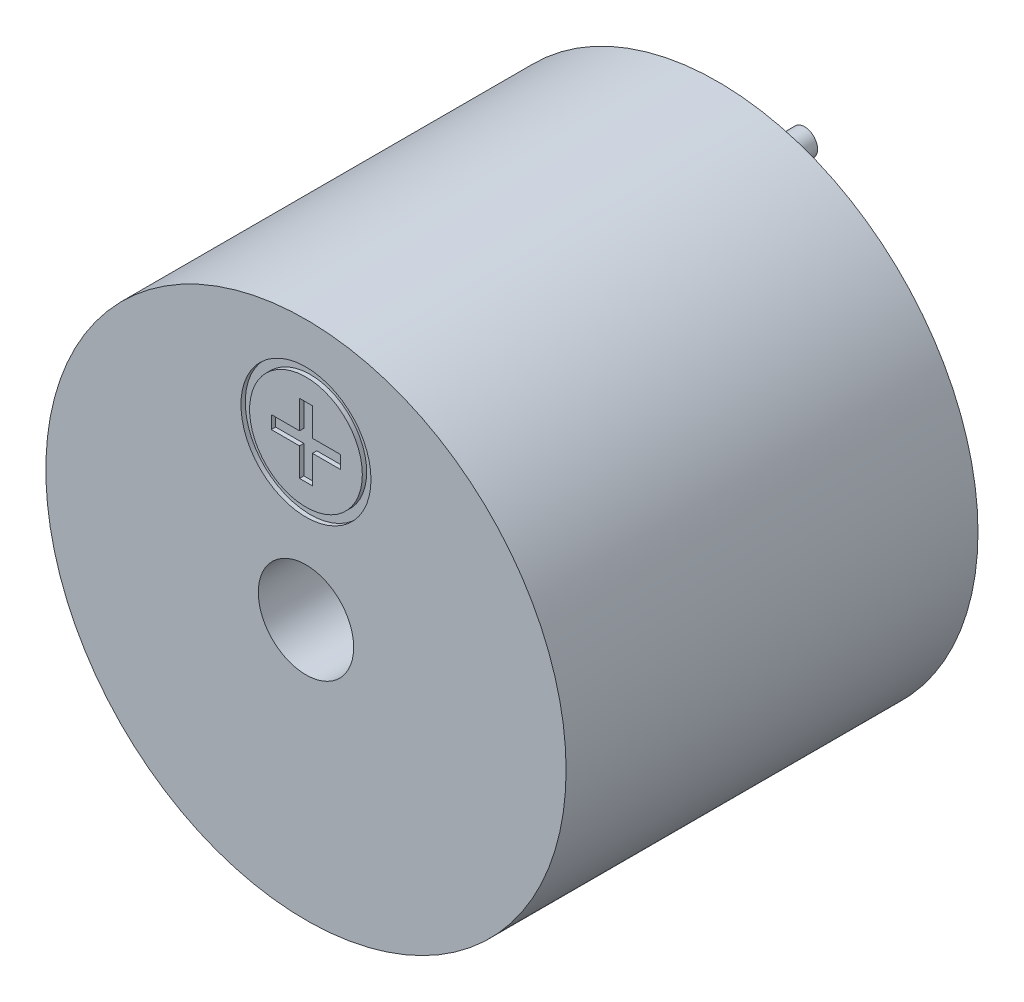
ISO-10303-21;
HEADER;
FILE_DESCRIPTION(('STEP AP214'),'2;1');
FILE_NAME('part.step','',(''),(''),'','','');
FILE_SCHEMA(('AUTOMOTIVE_DESIGN { 1 0 10303 214 1 1 1 1 }'));
ENDSEC;
DATA;
#1=APPLICATION_CONTEXT('core data for automotive mechanical design processes');
#2=APPLICATION_PROTOCOL_DEFINITION('international standard','automotive_design',2000,#1);
#3=PRODUCT_CONTEXT('',#1,'mechanical');
#4=PRODUCT('Part','Part','',(#3));
#5=PRODUCT_RELATED_PRODUCT_CATEGORY('part','',(#4));
#6=PRODUCT_DEFINITION_FORMATION('','',#4);
#7=PRODUCT_DEFINITION_CONTEXT('part definition',#1,'design');
#8=PRODUCT_DEFINITION('design','',#6,#7);
#9=PRODUCT_DEFINITION_SHAPE('','',#8);
#10=(LENGTH_UNIT() NAMED_UNIT(*) SI_UNIT(.MILLI.,.METRE.));
#11=(NAMED_UNIT(*) PLANE_ANGLE_UNIT() SI_UNIT($,.RADIAN.));
#12=(NAMED_UNIT(*) SI_UNIT($,.STERADIAN.) SOLID_ANGLE_UNIT());
#13=UNCERTAINTY_MEASURE_WITH_UNIT(LENGTH_MEASURE(1.E-05),#10,'distance_accuracy_value','');
#14=(GEOMETRIC_REPRESENTATION_CONTEXT(3) GLOBAL_UNCERTAINTY_ASSIGNED_CONTEXT((#13)) GLOBAL_UNIT_ASSIGNED_CONTEXT((#10,
#11,#12)) REPRESENTATION_CONTEXT('',''));
#15=CARTESIAN_POINT('',(0.,0.,0.));
#16=DIRECTION('',(0.,0.,1.));
#17=DIRECTION('',(1.,0.,0.));
#18=AXIS2_PLACEMENT_3D('',#15,#16,#17);
#19=CARTESIAN_POINT('',(0.,0.,3.));
#20=DIRECTION('',(0.,0.,-1.));
#21=DIRECTION('',(-1.,0.,0.));
#22=AXIS2_PLACEMENT_3D('',#19,#20,#21);
#23=CYLINDRICAL_SURFACE('',#22,6.);
#24=CARTESIAN_POINT('',(0.,0.,0.));
#25=DIRECTION('',(0.,0.,1.));
#26=DIRECTION('',(1.,0.,0.));
#27=AXIS2_PLACEMENT_3D('',#24,#25,#26);
#28=CIRCLE('',#27,6.);
#29=CARTESIAN_POINT('',(6.,0.,0.));
#30=VERTEX_POINT('',#29);
#31=EDGE_CURVE('E298',#30,#30,#28,.T.);
#32=ORIENTED_EDGE('',*,*,#31,.T.);
#33=EDGE_LOOP('',(#32));
#34=FACE_BOUND('',#33,.T.);
#35=CARTESIAN_POINT('',(0.,0.,9.5));
#36=DIRECTION('',(0.,0.,1.));
#37=DIRECTION('',(1.,0.,0.));
#38=AXIS2_PLACEMENT_3D('',#35,#36,#37);
#39=CIRCLE('',#38,6.);
#40=CARTESIAN_POINT('',(6.,0.,9.5));
#41=VERTEX_POINT('',#40);
#42=EDGE_CURVE('E291',#41,#41,#39,.T.);
#43=ORIENTED_EDGE('',*,*,#42,.F.);
#44=EDGE_LOOP('',(#43));
#45=FACE_BOUND('',#44,.T.);
#46=ADVANCED_FACE('F84',(#34,#45),#23,.T.);
#47=CARTESIAN_POINT('',(0.,0.,0.));
#48=DIRECTION('',(0.,0.,1.));
#49=DIRECTION('',(1.,0.,0.));
#50=AXIS2_PLACEMENT_3D('',#47,#48,#49);
#51=PLANE('',#50);
#52=CARTESIAN_POINT('',(0.,-3.8,0.));
#53=DIRECTION('',(0.,0.,1.));
#54=DIRECTION('',(1.,0.,0.));
#55=AXIS2_PLACEMENT_3D('',#52,#53,#54);
#56=CIRCLE('',#55,0.3);
#57=CARTESIAN_POINT('',(0.3,-3.8,0.));
#58=VERTEX_POINT('',#57);
#59=EDGE_CURVE('E12',#58,#58,#56,.F.);
#60=ORIENTED_EDGE('',*,*,#59,.F.);
#61=EDGE_LOOP('',(#60));
#62=FACE_BOUND('',#61,.T.);
#63=CARTESIAN_POINT('',(0.,3.8,0.));
#64=DIRECTION('',(0.,0.,1.));
#65=DIRECTION('',(1.,0.,0.));
#66=AXIS2_PLACEMENT_3D('',#63,#64,#65);
#67=CIRCLE('',#66,0.3);
#68=CARTESIAN_POINT('',(0.3,3.8,0.));
#69=VERTEX_POINT('',#68);
#70=EDGE_CURVE('E92',#69,#69,#67,.F.);
#71=ORIENTED_EDGE('',*,*,#70,.F.);
#72=EDGE_LOOP('',(#71));
#73=FACE_BOUND('',#72,.T.);
#74=ORIENTED_EDGE('',*,*,#31,.F.);
#75=EDGE_LOOP('',(#74));
#76=FACE_BOUND('',#75,.T.);
#77=ADVANCED_FACE('F307',(#62,#73,#76),#51,.F.);
#78=CARTESIAN_POINT('',(0.,0.,9.5));
#79=DIRECTION('',(0.,0.,1.));
#80=DIRECTION('',(1.,0.,0.));
#81=AXIS2_PLACEMENT_3D('',#78,#79,#80);
#82=PLANE('',#81);
#83=CARTESIAN_POINT('',(0.,3.55,9.5));
#84=DIRECTION('',(0.,0.,1.));
#85=DIRECTION('',(1.,0.,0.));
#86=AXIS2_PLACEMENT_3D('',#83,#84,#85);
#87=CIRCLE('',#86,1.5);
#88=CARTESIAN_POINT('',(1.5,3.55,9.5));
#89=VERTEX_POINT('',#88);
#90=EDGE_CURVE('E352',#89,#89,#87,.T.);
#91=ORIENTED_EDGE('',*,*,#90,.F.);
#92=EDGE_LOOP('',(#91));
#93=FACE_BOUND('',#92,.T.);
#94=CARTESIAN_POINT('',(0.,0.,9.5));
#95=DIRECTION('',(0.,0.,1.));
#96=DIRECTION('',(1.,0.,0.));
#97=AXIS2_PLACEMENT_3D('',#94,#95,#96);
#98=CIRCLE('',#97,1.1);
#99=CARTESIAN_POINT('',(1.1,0.,9.5));
#100=VERTEX_POINT('',#99);
#101=EDGE_CURVE('E259',#100,#100,#98,.T.);
#102=ORIENTED_EDGE('',*,*,#101,.F.);
#103=EDGE_LOOP('',(#102));
#104=FACE_BOUND('',#103,.T.);
#105=ORIENTED_EDGE('',*,*,#42,.T.);
#106=EDGE_LOOP('',(#105));
#107=FACE_BOUND('',#106,.T.);
#108=ADVANCED_FACE('F310',(#93,#104,#107),#82,.T.);
#109=CARTESIAN_POINT('',(0.,0.,3.));
#110=DIRECTION('',(0.,0.,1.));
#111=DIRECTION('',(1.,0.,0.));
#112=AXIS2_PLACEMENT_3D('',#109,#110,#111);
#113=CYLINDRICAL_SURFACE('',#112,1.1);
#114=CARTESIAN_POINT('',(0.,0.,3.));
#115=DIRECTION('',(0.,0.,1.));
#116=DIRECTION('',(1.,0.,0.));
#117=AXIS2_PLACEMENT_3D('',#114,#115,#116);
#118=CIRCLE('',#117,1.1);
#119=CARTESIAN_POINT('',(1.1,0.,3.));
#120=VERTEX_POINT('',#119);
#121=EDGE_CURVE('E287',#120,#120,#118,.T.);
#122=CARTESIAN_POINT('',(1.1,0.,3.));
#123=CARTESIAN_POINT('',(1.1,0.,3.06770833333333));
#124=CARTESIAN_POINT('',(1.1,0.,3.13541666666667));
#125=CARTESIAN_POINT('',(1.1,0.,3.27083333333333));
#126=CARTESIAN_POINT('',(1.1,0.,3.33854166666667));
#127=CARTESIAN_POINT('',(1.1,0.,3.47395833333333));
#128=CARTESIAN_POINT('',(1.1,0.,3.54166666666667));
#129=CARTESIAN_POINT('',(1.1,0.,3.67708333333333));
#130=CARTESIAN_POINT('',(1.1,0.,3.74479166666667));
#131=CARTESIAN_POINT('',(1.1,0.,3.88020833333333));
#132=CARTESIAN_POINT('',(1.1,0.,3.94791666666667));
#133=CARTESIAN_POINT('',(1.1,0.,4.08333333333333));
#134=CARTESIAN_POINT('',(1.1,0.,4.15104166666667));
#135=CARTESIAN_POINT('',(1.1,0.,4.28645833333333));
#136=CARTESIAN_POINT('',(1.1,0.,4.35416666666667));
#137=CARTESIAN_POINT('',(1.1,0.,4.48958333333333));
#138=CARTESIAN_POINT('',(1.1,0.,4.55729166666667));
#139=CARTESIAN_POINT('',(1.1,0.,4.69270833333333));
#140=CARTESIAN_POINT('',(1.1,0.,4.76041666666667));
#141=CARTESIAN_POINT('',(1.1,0.,4.89583333333333));
#142=CARTESIAN_POINT('',(1.1,0.,4.96354166666667));
#143=CARTESIAN_POINT('',(1.1,0.,5.09895833333333));
#144=CARTESIAN_POINT('',(1.1,0.,5.16666666666667));
#145=CARTESIAN_POINT('',(1.1,0.,5.30208333333333));
#146=CARTESIAN_POINT('',(1.1,0.,5.36979166666667));
#147=CARTESIAN_POINT('',(1.1,0.,5.50520833333333));
#148=CARTESIAN_POINT('',(1.1,0.,5.57291666666667));
#149=CARTESIAN_POINT('',(1.1,0.,5.70833333333333));
#150=CARTESIAN_POINT('',(1.1,0.,5.77604166666667));
#151=CARTESIAN_POINT('',(1.1,0.,5.91145833333333));
#152=CARTESIAN_POINT('',(1.1,0.,5.97916666666667));
#153=CARTESIAN_POINT('',(1.1,0.,6.11458333333333));
#154=CARTESIAN_POINT('',(1.1,0.,6.18229166666667));
#155=CARTESIAN_POINT('',(1.1,0.,6.31770833333333));
#156=CARTESIAN_POINT('',(1.1,0.,6.38541666666667));
#157=CARTESIAN_POINT('',(1.1,0.,6.52083333333333));
#158=CARTESIAN_POINT('',(1.1,0.,6.58854166666667));
#159=CARTESIAN_POINT('',(1.1,0.,6.72395833333333));
#160=CARTESIAN_POINT('',(1.1,0.,6.79166666666667));
#161=CARTESIAN_POINT('',(1.1,0.,6.92708333333333));
#162=CARTESIAN_POINT('',(1.1,0.,6.99479166666667));
#163=CARTESIAN_POINT('',(1.1,0.,7.13020833333333));
#164=CARTESIAN_POINT('',(1.1,0.,7.19791666666667));
#165=CARTESIAN_POINT('',(1.1,0.,7.33333333333333));
#166=CARTESIAN_POINT('',(1.1,0.,7.40104166666667));
#167=CARTESIAN_POINT('',(1.1,0.,7.53645833333333));
#168=CARTESIAN_POINT('',(1.1,0.,7.60416666666667));
#169=CARTESIAN_POINT('',(1.1,0.,7.73958333333333));
#170=CARTESIAN_POINT('',(1.1,0.,7.80729166666667));
#171=CARTESIAN_POINT('',(1.1,0.,7.94270833333333));
#172=CARTESIAN_POINT('',(1.1,0.,8.01041666666667));
#173=CARTESIAN_POINT('',(1.1,0.,8.14583333333333));
#174=CARTESIAN_POINT('',(1.1,0.,8.21354166666667));
#175=CARTESIAN_POINT('',(1.1,0.,8.34895833333333));
#176=CARTESIAN_POINT('',(1.1,0.,8.41666666666667));
#177=CARTESIAN_POINT('',(1.1,0.,8.55208333333333));
#178=CARTESIAN_POINT('',(1.1,0.,8.61979166666667));
#179=CARTESIAN_POINT('',(1.1,0.,8.75520833333333));
#180=CARTESIAN_POINT('',(1.1,0.,8.82291666666667));
#181=CARTESIAN_POINT('',(1.1,0.,8.95833333333333));
#182=CARTESIAN_POINT('',(1.1,0.,9.02604166666667));
#183=CARTESIAN_POINT('',(1.1,0.,9.16145833333333));
#184=CARTESIAN_POINT('',(1.1,0.,9.22916666666667));
#185=CARTESIAN_POINT('',(1.1,0.,9.36458333333333));
#186=CARTESIAN_POINT('',(1.1,0.,9.43229166666667));
#187=CARTESIAN_POINT('',(1.1,0.,9.5));
#188=B_SPLINE_CURVE_WITH_KNOTS('',3,(#122,#123,#124,#125,#126,#127,#128,#129,#130,#131,#132,
#133,#134,#135,#136,#137,#138,#139,#140,#141,#142,#143,#144,#145,#146,#147,#148,#149,#150,#151,
#152,#153,#154,#155,#156,#157,#158,#159,#160,#161,#162,#163,#164,#165,#166,#167,#168,#169,#170,
#171,#172,#173,#174,#175,#176,#177,#178,#179,#180,#181,#182,#183,#184,#185,#186,#187),
.UNSPECIFIED.,.F.,.F.,(4,2,2,2,2,2,2,2,2,2,2,2,2,2,2,2,2,2,2,2,2,2,2,2,2,2,2,2,2,2,2,2,4),(0.,
0.203125,0.40625,0.609375,0.8125,1.015625,1.21875,1.421875,1.625,1.828125,2.03125,2.234375,
2.4375,2.640625,2.84375,3.046875,3.25,3.453125,3.65625,3.859375,4.0625,4.265625,4.46875,
4.671875,4.875,5.078125,5.28125,5.484375,5.6875,5.890625,6.09375,6.296875,6.5),.UNSPECIFIED.);
#189=EDGE_CURVE('BSEAM319',#120,#100,#188,.T.);
#190=ORIENTED_EDGE('',*,*,#121,.F.);
#191=ORIENTED_EDGE('',*,*,#101,.T.);
#192=ORIENTED_EDGE('',*,*,#189,.T.);
#193=ORIENTED_EDGE('',*,*,#189,.F.);
#194=EDGE_LOOP('',(#190,#192,#191,#193));
#195=FACE_BOUND('',#194,.T.);
#196=ADVANCED_FACE('F319',(#195),#113,.F.);
#197=CARTESIAN_POINT('',(0.,0.,3.));
#198=DIRECTION('',(0.,0.,1.));
#199=DIRECTION('',(1.,0.,0.));
#200=AXIS2_PLACEMENT_3D('',#197,#198,#199);
#201=PLANE('',#200);
#202=ORIENTED_EDGE('',*,*,#121,.T.);
#203=EDGE_LOOP('',(#202));
#204=FACE_BOUND('',#203,.T.);
#205=ADVANCED_FACE('F326',(#204),#201,.T.);
#206=CARTESIAN_POINT('',(0.,3.55,9.4));
#207=DIRECTION('',(0.,0.,1.));
#208=DIRECTION('',(1.,0.,0.));
#209=AXIS2_PLACEMENT_3D('',#206,#207,#208);
#210=CYLINDRICAL_SURFACE('',#209,1.3);
#211=CARTESIAN_POINT('',(0.,3.55,9.4));
#212=DIRECTION('',(0.,0.,1.));
#213=DIRECTION('',(1.,0.,0.));
#214=AXIS2_PLACEMENT_3D('',#211,#212,#213);
#215=CIRCLE('',#214,1.3);
#216=CARTESIAN_POINT('',(1.3,3.55,9.4));
#217=VERTEX_POINT('',#216);
#218=EDGE_CURVE('E358',#217,#217,#215,.T.);
#219=ORIENTED_EDGE('',*,*,#218,.T.);
#220=EDGE_LOOP('',(#219));
#221=FACE_BOUND('',#220,.T.);
#222=CARTESIAN_POINT('',(0.,3.55,9.5));
#223=DIRECTION('',(0.,0.,1.));
#224=DIRECTION('',(1.,0.,0.));
#225=AXIS2_PLACEMENT_3D('',#222,#223,#224);
#226=CIRCLE('',#225,1.3);
#227=CARTESIAN_POINT('',(1.3,3.55,9.5));
#228=VERTEX_POINT('',#227);
#229=EDGE_CURVE('E349',#228,#228,#226,.T.);
#230=ORIENTED_EDGE('',*,*,#229,.F.);
#231=EDGE_LOOP('',(#230));
#232=FACE_BOUND('',#231,.T.);
#233=ADVANCED_FACE('F440',(#221,#232),#210,.T.);
#234=CARTESIAN_POINT('',(0.,3.55,9.4));
#235=DIRECTION('',(0.,0.,1.));
#236=DIRECTION('',(1.,0.,0.));
#237=AXIS2_PLACEMENT_3D('',#234,#235,#236);
#238=CYLINDRICAL_SURFACE('',#237,1.5);
#239=CARTESIAN_POINT('',(0.,3.55,9.4));
#240=DIRECTION('',(0.,0.,1.));
#241=DIRECTION('',(1.,0.,0.));
#242=AXIS2_PLACEMENT_3D('',#239,#240,#241);
#243=CIRCLE('',#242,1.5);
#244=CARTESIAN_POINT('',(1.5,3.55,9.4));
#245=VERTEX_POINT('',#244);
#246=EDGE_CURVE('E216',#245,#245,#243,.T.);
#247=ORIENTED_EDGE('',*,*,#246,.F.);
#248=EDGE_LOOP('',(#247));
#249=FACE_BOUND('',#248,.T.);
#250=ORIENTED_EDGE('',*,*,#90,.T.);
#251=EDGE_LOOP('',(#250));
#252=FACE_BOUND('',#251,.T.);
#253=ADVANCED_FACE('F341',(#249,#252),#238,.F.);
#254=CARTESIAN_POINT('',(0.,0.,9.4));
#255=DIRECTION('',(0.,0.,1.));
#256=DIRECTION('',(1.,0.,0.));
#257=AXIS2_PLACEMENT_3D('',#254,#255,#256);
#258=PLANE('',#257);
#259=ORIENTED_EDGE('',*,*,#218,.F.);
#260=EDGE_LOOP('',(#259));
#261=FACE_BOUND('',#260,.T.);
#262=ORIENTED_EDGE('',*,*,#246,.T.);
#263=EDGE_LOOP('',(#262));
#264=FACE_BOUND('',#263,.T.);
#265=ADVANCED_FACE('F333',(#261,#264),#258,.T.);
#266=DIRECTION('',(1.,0.,0.));
#267=VECTOR('',#266,1.);
#268=CARTESIAN_POINT('',(0.,2.75,9.5));
#269=LINE('',#268,#267);
#270=CARTESIAN_POINT('',(-0.15,2.75,9.5));
#271=VERTEX_POINT('',#270);
#272=CARTESIAN_POINT('',(0.15,2.75,9.5));
#273=VERTEX_POINT('',#272);
#274=EDGE_CURVE('E99',#271,#273,#269,.T.);
#275=ORIENTED_EDGE('',*,*,#274,.F.);
#276=DIRECTION('',(0.,-1.,0.));
#277=VECTOR('',#276,1.);
#278=CARTESIAN_POINT('',(-0.149999999999999,0.,9.5));
#279=LINE('',#278,#277);
#280=CARTESIAN_POINT('',(-0.15,3.4,9.5));
#281=VERTEX_POINT('',#280);
#282=EDGE_CURVE('E253',#281,#271,#279,.T.);
#283=ORIENTED_EDGE('',*,*,#282,.F.);
#284=DIRECTION('',(1.,0.,0.));
#285=VECTOR('',#284,1.);
#286=CARTESIAN_POINT('',(0.,3.4,9.5));
#287=LINE('',#286,#285);
#288=CARTESIAN_POINT('',(-0.8,3.4,9.5));
#289=VERTEX_POINT('',#288);
#290=EDGE_CURVE('E250',#289,#281,#287,.T.);
#291=ORIENTED_EDGE('',*,*,#290,.F.);
#292=DIRECTION('',(0.,-1.,0.));
#293=VECTOR('',#292,1.);
#294=CARTESIAN_POINT('',(-0.8,0.,9.5));
#295=LINE('',#294,#293);
#296=CARTESIAN_POINT('',(-0.8,3.7,9.5));
#297=VERTEX_POINT('',#296);
#298=EDGE_CURVE('E183',#297,#289,#295,.T.);
#299=ORIENTED_EDGE('',*,*,#298,.F.);
#300=DIRECTION('',(-1.,0.,0.));
#301=VECTOR('',#300,1.);
#302=CARTESIAN_POINT('',(0.,3.7,9.5));
#303=LINE('',#302,#301);
#304=CARTESIAN_POINT('',(-0.15,3.7,9.5));
#305=VERTEX_POINT('',#304);
#306=EDGE_CURVE('E244',#305,#297,#303,.T.);
#307=ORIENTED_EDGE('',*,*,#306,.F.);
#308=DIRECTION('',(0.,-1.,0.));
#309=VECTOR('',#308,1.);
#310=CARTESIAN_POINT('',(-0.15,0.,9.5));
#311=LINE('',#310,#309);
#312=CARTESIAN_POINT('',(-0.15,4.35,9.5));
#313=VERTEX_POINT('',#312);
#314=EDGE_CURVE('E240',#313,#305,#311,.T.);
#315=ORIENTED_EDGE('',*,*,#314,.F.);
#316=DIRECTION('',(-1.,0.,0.));
#317=VECTOR('',#316,1.);
#318=CARTESIAN_POINT('',(0.,4.35,9.5));
#319=LINE('',#318,#317);
#320=CARTESIAN_POINT('',(0.15,4.35,9.5));
#321=VERTEX_POINT('',#320);
#322=EDGE_CURVE('E236',#321,#313,#319,.T.);
#323=ORIENTED_EDGE('',*,*,#322,.F.);
#324=DIRECTION('',(0.,1.,0.));
#325=VECTOR('',#324,1.);
#326=CARTESIAN_POINT('',(0.15,0.,9.5));
#327=LINE('',#326,#325);
#328=CARTESIAN_POINT('',(0.15,3.7,9.5));
#329=VERTEX_POINT('',#328);
#330=EDGE_CURVE('E232',#329,#321,#327,.T.);
#331=ORIENTED_EDGE('',*,*,#330,.F.);
#332=DIRECTION('',(-1.,0.,0.));
#333=VECTOR('',#332,1.);
#334=CARTESIAN_POINT('',(0.,3.7,9.5));
#335=LINE('',#334,#333);
#336=CARTESIAN_POINT('',(0.8,3.7,9.5));
#337=VERTEX_POINT('',#336);
#338=EDGE_CURVE('E228',#337,#329,#335,.T.);
#339=ORIENTED_EDGE('',*,*,#338,.F.);
#340=DIRECTION('',(0.,-1.,0.));
#341=VECTOR('',#340,1.);
#342=CARTESIAN_POINT('',(0.8,0.,9.5));
#343=LINE('',#342,#341);
#344=CARTESIAN_POINT('',(0.8,3.4,9.5));
#345=VERTEX_POINT('',#344);
#346=EDGE_CURVE('E224',#337,#345,#343,.T.);
#347=ORIENTED_EDGE('',*,*,#346,.T.);
#348=DIRECTION('',(-1.,0.,0.));
#349=VECTOR('',#348,1.);
#350=CARTESIAN_POINT('',(0.,3.4,9.5));
#351=LINE('',#350,#349);
#352=CARTESIAN_POINT('',(0.15,3.4,9.5));
#353=VERTEX_POINT('',#352);
#354=EDGE_CURVE('E220',#345,#353,#351,.T.);
#355=ORIENTED_EDGE('',*,*,#354,.T.);
#356=DIRECTION('',(0.,1.,0.));
#357=VECTOR('',#356,1.);
#358=CARTESIAN_POINT('',(0.15,0.,9.5));
#359=LINE('',#358,#357);
#360=EDGE_CURVE('E215',#273,#353,#359,.T.);
#361=ORIENTED_EDGE('',*,*,#360,.F.);
#362=EDGE_LOOP('',(#275,#283,#291,#299,#307,#315,#323,#331,#339,#347,#355,#361));
#363=FACE_BOUND('',#362,.T.);
#364=ORIENTED_EDGE('',*,*,#229,.T.);
#365=EDGE_LOOP('',(#364));
#366=FACE_BOUND('',#365,.T.);
#367=ADVANCED_FACE('F322',(#363,#366),#82,.T.);
#368=CARTESIAN_POINT('',(0.,2.75,9.4));
#369=DIRECTION('',(0.,-1.,0.));
#370=DIRECTION('',(0.,0.,-1.));
#371=AXIS2_PLACEMENT_3D('',#368,#369,#370);
#372=PLANE('',#371);
#373=ORIENTED_EDGE('',*,*,#274,.T.);
#374=DIRECTION('',(0.,0.,1.));
#375=VECTOR('',#374,1.);
#376=CARTESIAN_POINT('',(0.15,2.75,9.4));
#377=LINE('',#376,#375);
#378=CARTESIAN_POINT('',(0.15,2.75,9.4));
#379=VERTEX_POINT('',#378);
#380=EDGE_CURVE('E147',#379,#273,#377,.T.);
#381=ORIENTED_EDGE('',*,*,#380,.F.);
#382=DIRECTION('',(1.,0.,0.));
#383=VECTOR('',#382,1.);
#384=CARTESIAN_POINT('',(0.,2.75,9.4));
#385=LINE('',#384,#383);
#386=CARTESIAN_POINT('',(-0.15,2.75,9.4));
#387=VERTEX_POINT('',#386);
#388=EDGE_CURVE('E256',#387,#379,#385,.T.);
#389=ORIENTED_EDGE('',*,*,#388,.F.);
#390=DIRECTION('',(0.,0.,1.));
#391=VECTOR('',#390,1.);
#392=CARTESIAN_POINT('',(-0.15,2.75,9.4));
#393=LINE('',#392,#391);
#394=EDGE_CURVE('E107',#387,#271,#393,.T.);
#395=ORIENTED_EDGE('',*,*,#394,.T.);
#396=EDGE_LOOP('',(#373,#381,#389,#395));
#397=FACE_BOUND('',#396,.T.);
#398=ADVANCED_FACE('F332',(#397),#372,.F.);
#399=CARTESIAN_POINT('',(-0.149999999999999,0.,9.4));
#400=DIRECTION('',(-1.,0.,0.));
#401=DIRECTION('',(0.,-1.,0.));
#402=AXIS2_PLACEMENT_3D('',#399,#400,#401);
#403=PLANE('',#402);
#404=ORIENTED_EDGE('',*,*,#282,.T.);
#405=ORIENTED_EDGE('',*,*,#394,.F.);
#406=DIRECTION('',(0.,-1.,0.));
#407=VECTOR('',#406,1.);
#408=CARTESIAN_POINT('',(-0.149999999999999,0.,9.4));
#409=LINE('',#408,#407);
#410=CARTESIAN_POINT('',(-0.15,3.4,9.4));
#411=VERTEX_POINT('',#410);
#412=EDGE_CURVE('E197',#411,#387,#409,.T.);
#413=ORIENTED_EDGE('',*,*,#412,.F.);
#414=DIRECTION('',(0.,0.,1.));
#415=VECTOR('',#414,1.);
#416=CARTESIAN_POINT('',(-0.15,3.4,9.4));
#417=LINE('',#416,#415);
#418=EDGE_CURVE('E188',#411,#281,#417,.T.);
#419=ORIENTED_EDGE('',*,*,#418,.T.);
#420=EDGE_LOOP('',(#404,#405,#413,#419));
#421=FACE_BOUND('',#420,.T.);
#422=ADVANCED_FACE('F339',(#421),#403,.F.);
#423=CARTESIAN_POINT('',(0.,3.4,9.4));
#424=DIRECTION('',(0.,-1.,0.));
#425=DIRECTION('',(0.,0.,-1.));
#426=AXIS2_PLACEMENT_3D('',#423,#424,#425);
#427=PLANE('',#426);
#428=ORIENTED_EDGE('',*,*,#290,.T.);
#429=ORIENTED_EDGE('',*,*,#418,.F.);
#430=DIRECTION('',(1.,0.,0.));
#431=VECTOR('',#430,1.);
#432=CARTESIAN_POINT('',(0.,3.4,9.4));
#433=LINE('',#432,#431);
#434=CARTESIAN_POINT('',(-0.8,3.4,9.4));
#435=VERTEX_POINT('',#434);
#436=EDGE_CURVE('E192',#435,#411,#433,.T.);
#437=ORIENTED_EDGE('',*,*,#436,.F.);
#438=DIRECTION('',(0.,0.,1.));
#439=VECTOR('',#438,1.);
#440=CARTESIAN_POINT('',(-0.8,3.4,9.4));
#441=LINE('',#440,#439);
#442=EDGE_CURVE('E176',#435,#289,#441,.T.);
#443=ORIENTED_EDGE('',*,*,#442,.T.);
#444=EDGE_LOOP('',(#428,#429,#437,#443));
#445=FACE_BOUND('',#444,.T.);
#446=ADVANCED_FACE('F193',(#445),#427,.F.);
#447=CARTESIAN_POINT('',(-0.8,0.,9.4));
#448=DIRECTION('',(-1.,0.,0.));
#449=DIRECTION('',(0.,0.,1.));
#450=AXIS2_PLACEMENT_3D('',#447,#448,#449);
#451=PLANE('',#450);
#452=ORIENTED_EDGE('',*,*,#298,.T.);
#453=ORIENTED_EDGE('',*,*,#442,.F.);
#454=DIRECTION('',(0.,-1.,0.));
#455=VECTOR('',#454,1.);
#456=CARTESIAN_POINT('',(-0.8,0.,9.4));
#457=LINE('',#456,#455);
#458=CARTESIAN_POINT('',(-0.8,3.7,9.4));
#459=VERTEX_POINT('',#458);
#460=EDGE_CURVE('E180',#459,#435,#457,.T.);
#461=ORIENTED_EDGE('',*,*,#460,.F.);
#462=DIRECTION('',(0.,0.,1.));
#463=VECTOR('',#462,1.);
#464=CARTESIAN_POINT('',(-0.8,3.7,9.4));
#465=LINE('',#464,#463);
#466=EDGE_CURVE('E189',#459,#297,#465,.T.);
#467=ORIENTED_EDGE('',*,*,#466,.T.);
#468=EDGE_LOOP('',(#452,#453,#461,#467));
#469=FACE_BOUND('',#468,.T.);
#470=ADVANCED_FACE('F178',(#469),#451,.F.);
#471=CARTESIAN_POINT('',(0.,3.7,9.4));
#472=DIRECTION('',(0.,1.,0.));
#473=DIRECTION('',(0.,0.,1.));
#474=AXIS2_PLACEMENT_3D('',#471,#472,#473);
#475=PLANE('',#474);
#476=ORIENTED_EDGE('',*,*,#306,.T.);
#477=ORIENTED_EDGE('',*,*,#466,.F.);
#478=DIRECTION('',(-1.,0.,0.));
#479=VECTOR('',#478,1.);
#480=CARTESIAN_POINT('',(0.,3.7,9.4));
#481=LINE('',#480,#479);
#482=CARTESIAN_POINT('',(-0.15,3.7,9.4));
#483=VERTEX_POINT('',#482);
#484=EDGE_CURVE('E203',#483,#459,#481,.T.);
#485=ORIENTED_EDGE('',*,*,#484,.F.);
#486=DIRECTION('',(0.,0.,1.));
#487=VECTOR('',#486,1.);
#488=CARTESIAN_POINT('',(-0.15,3.7,9.4));
#489=LINE('',#488,#487);
#490=EDGE_CURVE('E264',#483,#305,#489,.T.);
#491=ORIENTED_EDGE('',*,*,#490,.T.);
#492=EDGE_LOOP('',(#476,#477,#485,#491));
#493=FACE_BOUND('',#492,.T.);
#494=ADVANCED_FACE('F397',(#493),#475,.F.);
#495=CARTESIAN_POINT('',(-0.15,0.,9.4));
#496=DIRECTION('',(-1.,0.,0.));
#497=DIRECTION('',(0.,0.,1.));
#498=AXIS2_PLACEMENT_3D('',#495,#496,#497);
#499=PLANE('',#498);
#500=ORIENTED_EDGE('',*,*,#314,.T.);
#501=ORIENTED_EDGE('',*,*,#490,.F.);
#502=DIRECTION('',(0.,-1.,0.));
#503=VECTOR('',#502,1.);
#504=CARTESIAN_POINT('',(-0.15,0.,9.4));
#505=LINE('',#504,#503);
#506=CARTESIAN_POINT('',(-0.15,4.35,9.4));
#507=VERTEX_POINT('',#506);
#508=EDGE_CURVE('E207',#507,#483,#505,.T.);
#509=ORIENTED_EDGE('',*,*,#508,.F.);
#510=DIRECTION('',(0.,0.,1.));
#511=VECTOR('',#510,1.);
#512=CARTESIAN_POINT('',(-0.15,4.35,9.4));
#513=LINE('',#512,#511);
#514=EDGE_CURVE('E267',#507,#313,#513,.T.);
#515=ORIENTED_EDGE('',*,*,#514,.T.);
#516=EDGE_LOOP('',(#500,#501,#509,#515));
#517=FACE_BOUND('',#516,.T.);
#518=ADVANCED_FACE('F393',(#517),#499,.F.);
#519=CARTESIAN_POINT('',(0.,4.35,9.4));
#520=DIRECTION('',(0.,1.,0.));
#521=DIRECTION('',(0.,0.,1.));
#522=AXIS2_PLACEMENT_3D('',#519,#520,#521);
#523=PLANE('',#522);
#524=ORIENTED_EDGE('',*,*,#322,.T.);
#525=ORIENTED_EDGE('',*,*,#514,.F.);
#526=DIRECTION('',(-1.,0.,0.));
#527=VECTOR('',#526,1.);
#528=CARTESIAN_POINT('',(0.,4.35,9.4));
#529=LINE('',#528,#527);
#530=CARTESIAN_POINT('',(0.15,4.35,9.4));
#531=VERTEX_POINT('',#530);
#532=EDGE_CURVE('E386',#531,#507,#529,.T.);
#533=ORIENTED_EDGE('',*,*,#532,.F.);
#534=DIRECTION('',(0.,0.,1.));
#535=VECTOR('',#534,1.);
#536=CARTESIAN_POINT('',(0.15,4.35,9.4));
#537=LINE('',#536,#535);
#538=EDGE_CURVE('E270',#531,#321,#537,.T.);
#539=ORIENTED_EDGE('',*,*,#538,.T.);
#540=EDGE_LOOP('',(#524,#525,#533,#539));
#541=FACE_BOUND('',#540,.T.);
#542=ADVANCED_FACE('F420',(#541),#523,.F.);
#543=CARTESIAN_POINT('',(0.15,0.,9.4));
#544=DIRECTION('',(1.,0.,0.));
#545=DIRECTION('',(0.,0.,-1.));
#546=AXIS2_PLACEMENT_3D('',#543,#544,#545);
#547=PLANE('',#546);
#548=ORIENTED_EDGE('',*,*,#330,.T.);
#549=ORIENTED_EDGE('',*,*,#538,.F.);
#550=DIRECTION('',(0.,1.,0.));
#551=VECTOR('',#550,1.);
#552=CARTESIAN_POINT('',(0.15,0.,9.4));
#553=LINE('',#552,#551);
#554=CARTESIAN_POINT('',(0.15,3.7,9.4));
#555=VERTEX_POINT('',#554);
#556=EDGE_CURVE('E382',#555,#531,#553,.T.);
#557=ORIENTED_EDGE('',*,*,#556,.F.);
#558=DIRECTION('',(0.,0.,1.));
#559=VECTOR('',#558,1.);
#560=CARTESIAN_POINT('',(0.15,3.7,9.4));
#561=LINE('',#560,#559);
#562=EDGE_CURVE('E273',#555,#329,#561,.T.);
#563=ORIENTED_EDGE('',*,*,#562,.T.);
#564=EDGE_LOOP('',(#548,#549,#557,#563));
#565=FACE_BOUND('',#564,.T.);
#566=ADVANCED_FACE('F417',(#565),#547,.F.);
#567=CARTESIAN_POINT('',(0.,3.7,9.4));
#568=DIRECTION('',(0.,1.,0.));
#569=DIRECTION('',(0.,0.,1.));
#570=AXIS2_PLACEMENT_3D('',#567,#568,#569);
#571=PLANE('',#570);
#572=ORIENTED_EDGE('',*,*,#338,.T.);
#573=ORIENTED_EDGE('',*,*,#562,.F.);
#574=DIRECTION('',(-1.,0.,0.));
#575=VECTOR('',#574,1.);
#576=CARTESIAN_POINT('',(0.,3.7,9.4));
#577=LINE('',#576,#575);
#578=CARTESIAN_POINT('',(0.8,3.7,9.4));
#579=VERTEX_POINT('',#578);
#580=EDGE_CURVE('E378',#579,#555,#577,.T.);
#581=ORIENTED_EDGE('',*,*,#580,.F.);
#582=DIRECTION('',(0.,0.,1.));
#583=VECTOR('',#582,1.);
#584=CARTESIAN_POINT('',(0.8,3.7,9.4));
#585=LINE('',#584,#583);
#586=EDGE_CURVE('E276',#579,#337,#585,.T.);
#587=ORIENTED_EDGE('',*,*,#586,.T.);
#588=EDGE_LOOP('',(#572,#573,#581,#587));
#589=FACE_BOUND('',#588,.T.);
#590=ADVANCED_FACE('F413',(#589),#571,.F.);
#591=CARTESIAN_POINT('',(0.8,0.,9.4));
#592=DIRECTION('',(-1.,0.,0.));
#593=DIRECTION('',(0.,0.,1.));
#594=AXIS2_PLACEMENT_3D('',#591,#592,#593);
#595=PLANE('',#594);
#596=ORIENTED_EDGE('',*,*,#346,.F.);
#597=ORIENTED_EDGE('',*,*,#586,.F.);
#598=DIRECTION('',(0.,-1.,0.));
#599=VECTOR('',#598,1.);
#600=CARTESIAN_POINT('',(0.8,0.,9.4));
#601=LINE('',#600,#599);
#602=CARTESIAN_POINT('',(0.8,3.4,9.4));
#603=VERTEX_POINT('',#602);
#604=EDGE_CURVE('E375',#579,#603,#601,.T.);
#605=ORIENTED_EDGE('',*,*,#604,.T.);
#606=DIRECTION('',(0.,0.,1.));
#607=VECTOR('',#606,1.);
#608=CARTESIAN_POINT('',(0.8,3.4,9.4));
#609=LINE('',#608,#607);
#610=EDGE_CURVE('E279',#603,#345,#609,.T.);
#611=ORIENTED_EDGE('',*,*,#610,.T.);
#612=EDGE_LOOP('',(#596,#597,#605,#611));
#613=FACE_BOUND('',#612,.T.);
#614=ADVANCED_FACE('F409',(#613),#595,.T.);
#615=CARTESIAN_POINT('',(0.,3.4,9.4));
#616=DIRECTION('',(0.,1.,0.));
#617=DIRECTION('',(0.,0.,1.));
#618=AXIS2_PLACEMENT_3D('',#615,#616,#617);
#619=PLANE('',#618);
#620=ORIENTED_EDGE('',*,*,#354,.F.);
#621=ORIENTED_EDGE('',*,*,#610,.F.);
#622=DIRECTION('',(-1.,0.,0.));
#623=VECTOR('',#622,1.);
#624=CARTESIAN_POINT('',(0.,3.4,9.4));
#625=LINE('',#624,#623);
#626=CARTESIAN_POINT('',(0.15,3.4,9.4));
#627=VERTEX_POINT('',#626);
#628=EDGE_CURVE('E372',#603,#627,#625,.T.);
#629=ORIENTED_EDGE('',*,*,#628,.T.);
#630=DIRECTION('',(0.,0.,1.));
#631=VECTOR('',#630,1.);
#632=CARTESIAN_POINT('',(0.15,3.4,9.4));
#633=LINE('',#632,#631);
#634=EDGE_CURVE('E282',#627,#353,#633,.T.);
#635=ORIENTED_EDGE('',*,*,#634,.T.);
#636=EDGE_LOOP('',(#620,#621,#629,#635));
#637=FACE_BOUND('',#636,.T.);
#638=ADVANCED_FACE('F405',(#637),#619,.T.);
#639=CARTESIAN_POINT('',(0.15,0.,9.4));
#640=DIRECTION('',(1.,0.,0.));
#641=DIRECTION('',(0.,0.,-1.));
#642=AXIS2_PLACEMENT_3D('',#639,#640,#641);
#643=PLANE('',#642);
#644=ORIENTED_EDGE('',*,*,#360,.T.);
#645=ORIENTED_EDGE('',*,*,#634,.F.);
#646=DIRECTION('',(0.,1.,0.));
#647=VECTOR('',#646,1.);
#648=CARTESIAN_POINT('',(0.15,0.,9.4));
#649=LINE('',#648,#647);
#650=EDGE_CURVE('E368',#379,#627,#649,.T.);
#651=ORIENTED_EDGE('',*,*,#650,.F.);
#652=ORIENTED_EDGE('',*,*,#380,.T.);
#653=EDGE_LOOP('',(#644,#645,#651,#652));
#654=FACE_BOUND('',#653,.T.);
#655=ADVANCED_FACE('F402',(#654),#643,.F.);
#656=CARTESIAN_POINT('',(0.,0.,9.4));
#657=DIRECTION('',(0.,0.,1.));
#658=DIRECTION('',(1.,0.,0.));
#659=AXIS2_PLACEMENT_3D('',#656,#657,#658);
#660=PLANE('',#659);
#661=ORIENTED_EDGE('',*,*,#388,.T.);
#662=ORIENTED_EDGE('',*,*,#650,.T.);
#663=ORIENTED_EDGE('',*,*,#628,.F.);
#664=ORIENTED_EDGE('',*,*,#604,.F.);
#665=ORIENTED_EDGE('',*,*,#580,.T.);
#666=ORIENTED_EDGE('',*,*,#556,.T.);
#667=ORIENTED_EDGE('',*,*,#532,.T.);
#668=ORIENTED_EDGE('',*,*,#508,.T.);
#669=ORIENTED_EDGE('',*,*,#484,.T.);
#670=ORIENTED_EDGE('',*,*,#460,.T.);
#671=ORIENTED_EDGE('',*,*,#436,.T.);
#672=ORIENTED_EDGE('',*,*,#412,.T.);
#673=EDGE_LOOP('',(#661,#662,#663,#664,#665,#666,#667,#668,#669,#670,#671,#672));
#674=FACE_BOUND('',#673,.T.);
#675=ADVANCED_FACE('F200',(#674),#660,.T.);
#676=CARTESIAN_POINT('',(0.,3.8,-2.));
#677=DIRECTION('',(0.,0.,1.));
#678=DIRECTION('',(1.,0.,0.));
#679=AXIS2_PLACEMENT_3D('',#676,#677,#678);
#680=CYLINDRICAL_SURFACE('',#679,0.3);
#681=CARTESIAN_POINT('',(0.,3.8,-2.));
#682=DIRECTION('',(0.,0.,-1.));
#683=DIRECTION('',(-1.,0.,0.));
#684=AXIS2_PLACEMENT_3D('',#681,#682,#683);
#685=CIRCLE('',#684,0.3);
#686=CARTESIAN_POINT('',(-0.3,3.8,-2.));
#687=VERTEX_POINT('',#686);
#688=EDGE_CURVE('E353',#687,#687,#685,.T.);
#689=ORIENTED_EDGE('',*,*,#688,.F.);
#690=EDGE_LOOP('',(#689));
#691=FACE_BOUND('',#690,.T.);
#692=ORIENTED_EDGE('',*,*,#70,.T.);
#693=EDGE_LOOP('',(#692));
#694=FACE_BOUND('',#693,.T.);
#695=ADVANCED_FACE('F305',(#691,#694),#680,.T.);
#696=CARTESIAN_POINT('',(0.,3.8,-2.));
#697=DIRECTION('',(0.,0.,-1.));
#698=DIRECTION('',(-1.,0.,0.));
#699=AXIS2_PLACEMENT_3D('',#696,#697,#698);
#700=PLANE('',#699);
#701=ORIENTED_EDGE('',*,*,#688,.T.);
#702=EDGE_LOOP('',(#701));
#703=FACE_BOUND('',#702,.T.);
#704=ADVANCED_FACE('F588',(#703),#700,.T.);
#705=CARTESIAN_POINT('',(0.,-3.8,-2.));
#706=DIRECTION('',(0.,0.,1.));
#707=DIRECTION('',(1.,0.,0.));
#708=AXIS2_PLACEMENT_3D('',#705,#706,#707);
#709=CYLINDRICAL_SURFACE('',#708,0.3);
#710=CARTESIAN_POINT('',(0.,-3.8,-2.));
#711=DIRECTION('',(0.,0.,-1.));
#712=DIRECTION('',(-1.,0.,0.));
#713=AXIS2_PLACEMENT_3D('',#710,#711,#712);
#714=CIRCLE('',#713,0.3);
#715=CARTESIAN_POINT('',(-0.3,-3.8,-2.));
#716=VERTEX_POINT('',#715);
#717=EDGE_CURVE('E361',#716,#716,#714,.T.);
#718=ORIENTED_EDGE('',*,*,#717,.F.);
#719=EDGE_LOOP('',(#718));
#720=FACE_BOUND('',#719,.T.);
#721=ORIENTED_EDGE('',*,*,#59,.T.);
#722=EDGE_LOOP('',(#721));
#723=FACE_BOUND('',#722,.T.);
#724=ADVANCED_FACE('F599',(#720,#723),#709,.T.);
#725=CARTESIAN_POINT('',(0.,-3.8,-2.));
#726=DIRECTION('',(0.,0.,-1.));
#727=DIRECTION('',(-1.,0.,0.));
#728=AXIS2_PLACEMENT_3D('',#725,#726,#727);
#729=PLANE('',#728);
#730=ORIENTED_EDGE('',*,*,#717,.T.);
#731=EDGE_LOOP('',(#730));
#732=FACE_BOUND('',#731,.T.);
#733=ADVANCED_FACE('F610',(#732),#729,.T.);
#734=CLOSED_SHELL('',(#46,#77,#108,#196,#205,#233,#253,#265,#367,#398,#422,#446,#470,#494,#518,
#542,#566,#590,#614,#638,#655,#675,#695,#704,#724,#733));
#735=MANIFOLD_SOLID_BREP('B2',#734);
#736=ADVANCED_BREP_SHAPE_REPRESENTATION('',(#18,#735),#14);
#737=SHAPE_DEFINITION_REPRESENTATION(#9,#736);
ENDSEC;
END-ISO-10303-21;
